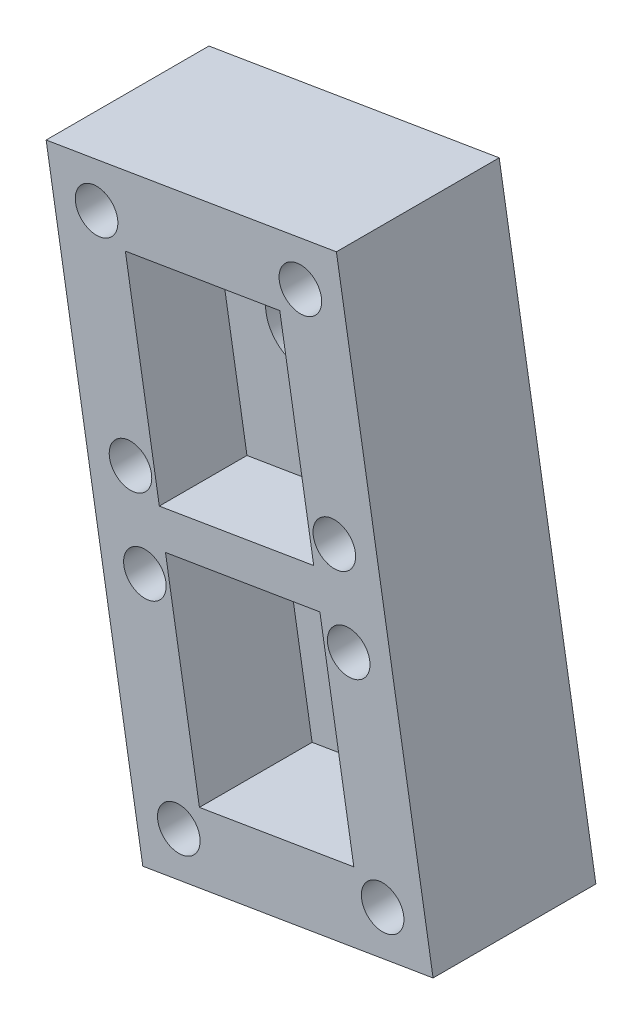
ISO-10303-21;
HEADER;
FILE_DESCRIPTION(('STEP AP214'),'2;1');
FILE_NAME('part.step','',(''),(''),'','','');
FILE_SCHEMA(('AUTOMOTIVE_DESIGN { 1 0 10303 214 1 1 1 1 }'));
ENDSEC;
DATA;
#1=APPLICATION_CONTEXT('core data for automotive mechanical design processes');
#2=APPLICATION_PROTOCOL_DEFINITION('international standard','automotive_design',2000,#1);
#3=PRODUCT_CONTEXT('',#1,'mechanical');
#4=PRODUCT('Part','Part','',(#3));
#5=PRODUCT_RELATED_PRODUCT_CATEGORY('part','',(#4));
#6=PRODUCT_DEFINITION_FORMATION('','',#4);
#7=PRODUCT_DEFINITION_CONTEXT('part definition',#1,'design');
#8=PRODUCT_DEFINITION('design','',#6,#7);
#9=PRODUCT_DEFINITION_SHAPE('','',#8);
#10=(LENGTH_UNIT() NAMED_UNIT(*) SI_UNIT(.MILLI.,.METRE.));
#11=(NAMED_UNIT(*) PLANE_ANGLE_UNIT() SI_UNIT($,.RADIAN.));
#12=(NAMED_UNIT(*) SI_UNIT($,.STERADIAN.) SOLID_ANGLE_UNIT());
#13=UNCERTAINTY_MEASURE_WITH_UNIT(LENGTH_MEASURE(1.E-05),#10,'distance_accuracy_value','');
#14=(GEOMETRIC_REPRESENTATION_CONTEXT(3) GLOBAL_UNCERTAINTY_ASSIGNED_CONTEXT((#13)) GLOBAL_UNIT_ASSIGNED_CONTEXT((#10,
#11,#12)) REPRESENTATION_CONTEXT('',''));
#15=CARTESIAN_POINT('',(0.,0.,0.));
#16=DIRECTION('',(0.,0.,1.));
#17=DIRECTION('',(1.,0.,0.));
#18=AXIS2_PLACEMENT_3D('',#15,#16,#17);
#19=CARTESIAN_POINT('',(202.203704217612,0.185034912218684,-50.762168081862));
#20=DIRECTION('',(0.,0.,-1.));
#21=DIRECTION('',(-1.,0.,0.));
#22=AXIS2_PLACEMENT_3D('',#19,#20,#21);
#23=CYLINDRICAL_SURFACE('',#22,3.49999999999999);
#24=CARTESIAN_POINT('',(202.203704217612,0.185034912218684,-56.762168081862));
#25=DIRECTION('',(0.,0.,-1.));
#26=DIRECTION('',(-1.,0.,0.));
#27=AXIS2_PLACEMENT_3D('',#24,#25,#26);
#28=CIRCLE('',#27,3.49999999999999);
#29=CARTESIAN_POINT('',(198.703704217612,0.185034912218684,-56.762168081862));
#30=VERTEX_POINT('',#29);
#31=EDGE_CURVE('E155',#30,#30,#28,.T.);
#32=ORIENTED_EDGE('',*,*,#31,.T.);
#33=EDGE_LOOP('',(#32));
#34=FACE_BOUND('',#33,.T.);
#35=CARTESIAN_POINT('',(202.203704217612,0.185034912218684,-52.762168081862));
#36=DIRECTION('',(0.,0.,1.));
#37=DIRECTION('',(1.,0.,0.));
#38=AXIS2_PLACEMENT_3D('',#35,#36,#37);
#39=CIRCLE('',#38,3.49999999999999);
#40=CARTESIAN_POINT('',(205.703704217612,0.185034912218684,-52.762168081862));
#41=VERTEX_POINT('',#40);
#42=EDGE_CURVE('E39',#41,#41,#39,.F.);
#43=ORIENTED_EDGE('',*,*,#42,.F.);
#44=EDGE_LOOP('',(#43));
#45=FACE_BOUND('',#44,.T.);
#46=ADVANCED_FACE('F35',(#34,#45),#23,.F.);
#47=CARTESIAN_POINT('',(0.,0.,-56.762168081862));
#48=DIRECTION('',(0.,0.,-1.));
#49=DIRECTION('',(-1.,0.,0.));
#50=AXIS2_PLACEMENT_3D('',#47,#48,#49);
#51=PLANE('',#50);
#52=CARTESIAN_POINT('',(202.203704217612,0.185034912218662,-56.762168081862));
#53=DIRECTION('',(0.,0.,-1.));
#54=DIRECTION('',(-1.,0.,0.));
#55=AXIS2_PLACEMENT_3D('',#52,#53,#54);
#56=CIRCLE('',#55,6.00000000000002);
#57=CARTESIAN_POINT('',(196.203704217612,0.185034912218662,-56.762168081862));
#58=VERTEX_POINT('',#57);
#59=EDGE_CURVE('E212',#58,#58,#56,.T.);
#60=ORIENTED_EDGE('',*,*,#59,.T.);
#61=EDGE_LOOP('',(#60));
#62=FACE_BOUND('',#61,.T.);
#63=ORIENTED_EDGE('',*,*,#31,.F.);
#64=EDGE_LOOP('',(#63));
#65=FACE_BOUND('',#64,.T.);
#66=ADVANCED_FACE('F350',(#62,#65),#51,.T.);
#67=CARTESIAN_POINT('',(191.152975596137,28.5047523708112,-42.762168081862));
#68=DIRECTION('',(-0.986423533912994,-0.164221228051065,0.));
#69=DIRECTION('',(0.164221228051065,-0.986423533912994,0.));
#70=AXIS2_PLACEMENT_3D('',#67,#68,#69);
#71=PLANE('',#70);
#72=DIRECTION('',(0.,0.,-1.));
#73=VECTOR('',#72,1.);
#74=CARTESIAN_POINT('',(194.355289543133,9.26949345950775,-42.762168081862));
#75=LINE('',#74,#73);
#76=CARTESIAN_POINT('',(194.355289543133,9.26949345950775,-43.762168081862));
#77=VERTEX_POINT('',#76);
#78=CARTESIAN_POINT('',(194.355289543133,9.26949345950775,-52.762168081862));
#79=VERTEX_POINT('',#78);
#80=EDGE_CURVE('E135',#77,#79,#75,.T.);
#81=ORIENTED_EDGE('',*,*,#80,.F.);
#82=DIRECTION('',(0.164221228051065,-0.986423533912994,0.));
#83=VECTOR('',#82,1.);
#84=CARTESIAN_POINT('',(191.152975596137,28.5047523708112,-43.762168081862));
#85=LINE('',#84,#83);
#86=CARTESIAN_POINT('',(197.064939805975,-7.00649485005672,-43.762168081862));
#87=VERTEX_POINT('',#86);
#88=EDGE_CURVE('E59',#77,#87,#85,.T.);
#89=ORIENTED_EDGE('',*,*,#88,.T.);
#90=DIRECTION('',(0.,0.,-1.));
#91=VECTOR('',#90,1.);
#92=CARTESIAN_POINT('',(197.064939805975,-7.00649485005673,-42.762168081862));
#93=LINE('',#92,#91);
#94=CARTESIAN_POINT('',(197.064939805975,-7.00649485005673,-52.762168081862));
#95=VERTEX_POINT('',#94);
#96=EDGE_CURVE('E258',#87,#95,#93,.T.);
#97=ORIENTED_EDGE('',*,*,#96,.T.);
#98=DIRECTION('',(0.164221228051065,-0.986423533912994,0.));
#99=VECTOR('',#98,1.);
#100=CARTESIAN_POINT('',(194.355289543133,9.26949345950775,-52.762168081862));
#101=LINE('',#100,#99);
#102=EDGE_CURVE('E145',#79,#95,#101,.T.);
#103=ORIENTED_EDGE('',*,*,#102,.F.);
#104=EDGE_LOOP('',(#81,#89,#97,#103));
#105=FACE_BOUND('',#104,.T.);
#106=ADVANCED_FACE('F356',(#105),#71,.F.);
#107=DIRECTION('',(0.,0.,-1.));
#108=VECTOR('',#107,1.);
#109=CARTESIAN_POINT('',(191.152975596137,28.5047523708112,-42.762168081862));
#110=LINE('',#109,#108);
#111=CARTESIAN_POINT('',(191.152975596137,28.5047523708112,-43.762168081862));
#112=VERTEX_POINT('',#111);
#113=CARTESIAN_POINT('',(191.152975596137,28.5047523708112,-50.762168081862));
#114=VERTEX_POINT('',#113);
#115=EDGE_CURVE('E257',#112,#114,#110,.T.);
#116=ORIENTED_EDGE('',*,*,#115,.F.);
#117=DIRECTION('',(0.164221228051065,-0.986423533912994,0.));
#118=VECTOR('',#117,1.);
#119=CARTESIAN_POINT('',(191.152975596137,28.5047523708112,-43.762168081862));
#120=LINE('',#119,#118);
#121=CARTESIAN_POINT('',(193.86262585898,12.2287640612467,-43.762168081862));
#122=VERTEX_POINT('',#121);
#123=EDGE_CURVE('E173',#112,#122,#120,.T.);
#124=ORIENTED_EDGE('',*,*,#123,.T.);
#125=DIRECTION('',(0.,0.,-1.));
#126=VECTOR('',#125,1.);
#127=CARTESIAN_POINT('',(193.86262585898,12.2287640612467,-42.762168081862));
#128=LINE('',#127,#126);
#129=CARTESIAN_POINT('',(193.86262585898,12.2287640612467,-50.762168081862));
#130=VERTEX_POINT('',#129);
#131=EDGE_CURVE('E221',#122,#130,#128,.T.);
#132=ORIENTED_EDGE('',*,*,#131,.T.);
#133=DIRECTION('',(-0.164221228051065,0.986423533912994,0.));
#134=VECTOR('',#133,1.);
#135=CARTESIAN_POINT('',(191.152975596137,28.5047523708112,-50.762168081862));
#136=LINE('',#135,#134);
#137=EDGE_CURVE('E244',#130,#114,#136,.T.);
#138=ORIENTED_EDGE('',*,*,#137,.T.);
#139=EDGE_LOOP('',(#116,#124,#132,#138));
#140=FACE_BOUND('',#139,.T.);
#141=ADVANCED_FACE('F308',(#140),#71,.F.);
#142=CARTESIAN_POINT('',(203.48326977005,30.5575177214495,-42.762168081862));
#143=DIRECTION('',(0.986423533912995,0.164221228051064,0.));
#144=DIRECTION('',(-0.164221228051064,0.986423533912995,0.));
#145=AXIS2_PLACEMENT_3D('',#142,#143,#144);
#146=PLANE('',#145);
#147=DIRECTION('',(0.,0.,-1.));
#148=VECTOR('',#147,1.);
#149=CARTESIAN_POINT('',(209.395233979888,-4.95372949941843,-42.762168081862));
#150=LINE('',#149,#148);
#151=CARTESIAN_POINT('',(209.395233979888,-4.95372949941843,-43.762168081862));
#152=VERTEX_POINT('',#151);
#153=CARTESIAN_POINT('',(209.395233979888,-4.95372949941843,-52.762168081862));
#154=VERTEX_POINT('',#153);
#155=EDGE_CURVE('E261',#152,#154,#150,.T.);
#156=ORIENTED_EDGE('',*,*,#155,.F.);
#157=DIRECTION('',(-0.164221228051064,0.986423533912995,0.));
#158=VECTOR('',#157,1.);
#159=CARTESIAN_POINT('',(203.48326977005,30.5575177214495,-43.762168081862));
#160=LINE('',#159,#158);
#161=CARTESIAN_POINT('',(206.685583717045,11.322258810146,-43.762168081862));
#162=VERTEX_POINT('',#161);
#163=EDGE_CURVE('E133',#152,#162,#160,.T.);
#164=ORIENTED_EDGE('',*,*,#163,.T.);
#165=DIRECTION('',(0.,0.,-1.));
#166=VECTOR('',#165,1.);
#167=CARTESIAN_POINT('',(206.685583717045,11.322258810146,-42.762168081862));
#168=LINE('',#167,#166);
#169=CARTESIAN_POINT('',(206.685583717045,11.322258810146,-52.762168081862));
#170=VERTEX_POINT('',#169);
#171=EDGE_CURVE('E126',#162,#170,#168,.T.);
#172=ORIENTED_EDGE('',*,*,#171,.T.);
#173=DIRECTION('',(-0.164221228051064,0.986423533912995,0.));
#174=VECTOR('',#173,1.);
#175=CARTESIAN_POINT('',(209.395233979888,-4.95372949941843,-52.762168081862));
#176=LINE('',#175,#174);
#177=EDGE_CURVE('E131',#154,#170,#176,.T.);
#178=ORIENTED_EDGE('',*,*,#177,.F.);
#179=EDGE_LOOP('',(#156,#164,#172,#178));
#180=FACE_BOUND('',#179,.T.);
#181=ADVANCED_FACE('F129',(#180),#146,.F.);
#182=DIRECTION('',(0.,0.,-1.));
#183=VECTOR('',#182,1.);
#184=CARTESIAN_POINT('',(206.192920032892,14.281529411885,-42.762168081862));
#185=LINE('',#184,#183);
#186=CARTESIAN_POINT('',(206.192920032892,14.281529411885,-43.762168081862));
#187=VERTEX_POINT('',#186);
#188=CARTESIAN_POINT('',(206.192920032892,14.281529411885,-50.762168081862));
#189=VERTEX_POINT('',#188);
#190=EDGE_CURVE('E136',#187,#189,#185,.T.);
#191=ORIENTED_EDGE('',*,*,#190,.F.);
#192=DIRECTION('',(-0.164221228051064,0.986423533912995,0.));
#193=VECTOR('',#192,1.);
#194=CARTESIAN_POINT('',(203.48326977005,30.5575177214495,-43.762168081862));
#195=LINE('',#194,#193);
#196=CARTESIAN_POINT('',(203.48326977005,30.5575177214495,-43.762168081862));
#197=VERTEX_POINT('',#196);
#198=EDGE_CURVE('E169',#187,#197,#195,.T.);
#199=ORIENTED_EDGE('',*,*,#198,.T.);
#200=DIRECTION('',(0.,0.,-1.));
#201=VECTOR('',#200,1.);
#202=CARTESIAN_POINT('',(203.48326977005,30.5575177214495,-42.762168081862));
#203=LINE('',#202,#201);
#204=CARTESIAN_POINT('',(203.48326977005,30.5575177214495,-50.762168081862));
#205=VERTEX_POINT('',#204);
#206=EDGE_CURVE('E263',#197,#205,#203,.T.);
#207=ORIENTED_EDGE('',*,*,#206,.T.);
#208=DIRECTION('',(0.164221228051064,-0.986423533912994,0.));
#209=VECTOR('',#208,1.);
#210=CARTESIAN_POINT('',(203.48326977005,30.5575177214495,-50.762168081862));
#211=LINE('',#210,#209);
#212=EDGE_CURVE('E254',#205,#189,#211,.T.);
#213=ORIENTED_EDGE('',*,*,#212,.T.);
#214=EDGE_LOOP('',(#191,#199,#207,#213));
#215=FACE_BOUND('',#214,.T.);
#216=ADVANCED_FACE('F297',(#215),#146,.F.);
#217=CARTESIAN_POINT('',(0.,0.,-50.762168081862));
#218=DIRECTION('',(0.,0.,-1.));
#219=DIRECTION('',(-1.,0.,0.));
#220=AXIS2_PLACEMENT_3D('',#217,#218,#219);
#221=PLANE('',#220);
#222=CARTESIAN_POINT('',(198.344505358412,23.3659879591741,-50.762168081862));
#223=DIRECTION('',(0.,0.,-1.));
#224=DIRECTION('',(-1.,0.,0.));
#225=AXIS2_PLACEMENT_3D('',#222,#223,#224);
#226=CIRCLE('',#225,2.99999999999999);
#227=CARTESIAN_POINT('',(195.344505358412,23.3659879591741,-50.762168081862));
#228=VERTEX_POINT('',#227);
#229=EDGE_CURVE('E225',#228,#228,#226,.T.);
#230=ORIENTED_EDGE('',*,*,#229,.T.);
#231=EDGE_LOOP('',(#230));
#232=FACE_BOUND('',#231,.T.);
#233=DIRECTION('',(-0.986423533912994,-0.164221228051065,0.));
#234=VECTOR('',#233,1.);
#235=CARTESIAN_POINT('',(193.86262585898,12.2287640612467,-50.762168081862));
#236=LINE('',#235,#234);
#237=EDGE_CURVE('E218',#189,#130,#236,.T.);
#238=ORIENTED_EDGE('',*,*,#237,.F.);
#239=ORIENTED_EDGE('',*,*,#212,.F.);
#240=DIRECTION('',(0.986423533912994,0.164221228051065,0.));
#241=VECTOR('',#240,1.);
#242=CARTESIAN_POINT('',(191.152975596137,28.5047523708112,-50.762168081862));
#243=LINE('',#242,#241);
#244=EDGE_CURVE('E251',#114,#205,#243,.T.);
#245=ORIENTED_EDGE('',*,*,#244,.F.);
#246=ORIENTED_EDGE('',*,*,#137,.F.);
#247=EDGE_LOOP('',(#238,#239,#245,#246));
#248=FACE_BOUND('',#247,.T.);
#249=ADVANCED_FACE('F302',(#232,#248),#221,.F.);
#250=CARTESIAN_POINT('',(198.344505358412,23.3659879591741,-56.762168081862));
#251=DIRECTION('',(0.,0.,1.));
#252=DIRECTION('',(1.,0.,0.));
#253=AXIS2_PLACEMENT_3D('',#250,#251,#252);
#254=CYLINDRICAL_SURFACE('',#253,2.99999999999999);
#255=ORIENTED_EDGE('',*,*,#229,.F.);
#256=EDGE_LOOP('',(#255));
#257=FACE_BOUND('',#256,.T.);
#258=CARTESIAN_POINT('',(198.344505358412,23.3659879591741,-56.762168081862));
#259=DIRECTION('',(0.,0.,-1.));
#260=DIRECTION('',(-1.,0.,0.));
#261=AXIS2_PLACEMENT_3D('',#258,#259,#260);
#262=CIRCLE('',#261,2.99999999999999);
#263=CARTESIAN_POINT('',(195.344505358412,23.3659879591741,-56.762168081862));
#264=VERTEX_POINT('',#263);
#265=EDGE_CURVE('E161',#264,#264,#262,.T.);
#266=ORIENTED_EDGE('',*,*,#265,.T.);
#267=EDGE_LOOP('',(#266));
#268=FACE_BOUND('',#267,.T.);
#269=ADVANCED_FACE('F374',(#257,#268),#254,.F.);
#270=CARTESIAN_POINT('',(215.72378017069,-9.47584218165903,-42.762168081862));
#271=DIRECTION('',(0.164221228051065,-0.986423533912994,0.));
#272=DIRECTION('',(0.986423533912994,0.164221228051065,0.));
#273=AXIS2_PLACEMENT_3D('',#270,#271,#272);
#274=PLANE('',#273);
#275=DIRECTION('',(-0.986423533912995,-0.164221228051062,0.));
#276=VECTOR('',#275,1.);
#277=CARTESIAN_POINT('',(217.20341547156,-9.22951033958249,-43.762168081862));
#278=LINE('',#277,#276);
#279=CARTESIAN_POINT('',(215.72378017069,-9.47584218165909,-43.762168081862));
#280=VERTEX_POINT('',#279);
#281=CARTESIAN_POINT('',(192.542827123735,-13.335041040859,-43.762168081862));
#282=VERTEX_POINT('',#281);
#283=EDGE_CURVE('E166',#280,#282,#278,.T.);
#284=ORIENTED_EDGE('',*,*,#283,.T.);
#285=DIRECTION('',(0.,0.,-1.));
#286=VECTOR('',#285,1.);
#287=CARTESIAN_POINT('',(192.542827123735,-13.335041040859,-42.762168081862));
#288=LINE('',#287,#286);
#289=CARTESIAN_POINT('',(192.542827123735,-13.335041040859,-56.762168081862));
#290=VERTEX_POINT('',#289);
#291=EDGE_CURVE('E260',#282,#290,#288,.T.);
#292=ORIENTED_EDGE('',*,*,#291,.T.);
#293=DIRECTION('',(-0.986423533912994,-0.164221228051065,0.));
#294=VECTOR('',#293,1.);
#295=CARTESIAN_POINT('',(215.72378017069,-9.47584218165903,-56.762168081862));
#296=LINE('',#295,#294);
#297=CARTESIAN_POINT('',(215.72378017069,-9.47584218165903,-56.762168081862));
#298=VERTEX_POINT('',#297);
#299=EDGE_CURVE('E231',#298,#290,#296,.T.);
#300=ORIENTED_EDGE('',*,*,#299,.F.);
#301=DIRECTION('',(0.,0.,-1.));
#302=VECTOR('',#301,1.);
#303=CARTESIAN_POINT('',(215.72378017069,-9.47584218165903,-42.762168081862));
#304=LINE('',#303,#302);
#305=EDGE_CURVE('E282',#280,#298,#304,.T.);
#306=ORIENTED_EDGE('',*,*,#305,.F.);
#307=EDGE_LOOP('',(#284,#292,#300,#306));
#308=FACE_BOUND('',#307,.T.);
#309=ADVANCED_FACE('F37',(#308),#274,.T.);
#310=CARTESIAN_POINT('',(208.00538245229,36.8860639122518,-42.762168081862));
#311=DIRECTION('',(0.986423533912995,0.164221228051063,0.));
#312=DIRECTION('',(-0.164221228051063,0.986423533912995,0.));
#313=AXIS2_PLACEMENT_3D('',#310,#311,#312);
#314=PLANE('',#313);
#315=DIRECTION('',(-0.164221228051063,0.986423533912995,0.));
#316=VECTOR('',#315,1.);
#317=CARTESIAN_POINT('',(208.00538245229,36.8860639122518,-43.762168081862));
#318=LINE('',#317,#316);
#319=CARTESIAN_POINT('',(208.00538245229,36.8860639122518,-43.762168081862));
#320=VERTEX_POINT('',#319);
#321=EDGE_CURVE('E210',#280,#320,#318,.T.);
#322=ORIENTED_EDGE('',*,*,#321,.F.);
#323=ORIENTED_EDGE('',*,*,#305,.T.);
#324=DIRECTION('',(0.164221228051063,-0.986423533912995,0.));
#325=VECTOR('',#324,1.);
#326=CARTESIAN_POINT('',(208.00538245229,36.8860639122518,-56.762168081862));
#327=LINE('',#326,#325);
#328=CARTESIAN_POINT('',(208.00538245229,36.8860639122518,-56.762168081862));
#329=VERTEX_POINT('',#328);
#330=EDGE_CURVE('E228',#329,#298,#327,.T.);
#331=ORIENTED_EDGE('',*,*,#330,.F.);
#332=DIRECTION('',(0.,0.,-1.));
#333=VECTOR('',#332,1.);
#334=CARTESIAN_POINT('',(208.00538245229,36.8860639122518,-42.762168081862));
#335=LINE('',#334,#333);
#336=EDGE_CURVE('E284',#320,#329,#335,.T.);
#337=ORIENTED_EDGE('',*,*,#336,.F.);
#338=EDGE_LOOP('',(#322,#323,#331,#337));
#339=FACE_BOUND('',#338,.T.);
#340=ADVANCED_FACE('F396',(#339),#314,.T.);
#341=CARTESIAN_POINT('',(184.824429405335,33.0268650530518,-42.762168081862));
#342=DIRECTION('',(-0.164221228051063,0.986423533912995,0.));
#343=DIRECTION('',(-0.986423533912995,-0.164221228051063,0.));
#344=AXIS2_PLACEMENT_3D('',#341,#342,#343);
#345=PLANE('',#344);
#346=DIRECTION('',(-0.986423533912995,-0.164221228051062,0.));
#347=VECTOR('',#346,1.);
#348=CARTESIAN_POINT('',(209.48501775316,37.1323957543284,-43.762168081862));
#349=LINE('',#348,#347);
#350=CARTESIAN_POINT('',(184.824429405335,33.0268650530518,-43.762168081862));
#351=VERTEX_POINT('',#350);
#352=EDGE_CURVE('E51',#320,#351,#349,.T.);
#353=ORIENTED_EDGE('',*,*,#352,.F.);
#354=ORIENTED_EDGE('',*,*,#336,.T.);
#355=DIRECTION('',(0.986423533912995,0.164221228051063,0.));
#356=VECTOR('',#355,1.);
#357=CARTESIAN_POINT('',(184.824429405335,33.0268650530518,-56.762168081862));
#358=LINE('',#357,#356);
#359=CARTESIAN_POINT('',(184.824429405335,33.0268650530518,-56.762168081862));
#360=VERTEX_POINT('',#359);
#361=EDGE_CURVE('E237',#360,#329,#358,.T.);
#362=ORIENTED_EDGE('',*,*,#361,.F.);
#363=DIRECTION('',(0.,0.,-1.));
#364=VECTOR('',#363,1.);
#365=CARTESIAN_POINT('',(184.824429405335,33.0268650530518,-42.762168081862));
#366=LINE('',#365,#364);
#367=EDGE_CURVE('E286',#351,#360,#366,.T.);
#368=ORIENTED_EDGE('',*,*,#367,.F.);
#369=EDGE_LOOP('',(#353,#354,#362,#368));
#370=FACE_BOUND('',#369,.T.);
#371=ADVANCED_FACE('F404',(#370),#345,.T.);
#372=CARTESIAN_POINT('',(192.542827123735,-13.335041040859,-42.762168081862));
#373=DIRECTION('',(-0.986423533912995,-0.164221228051062,0.));
#374=DIRECTION('',(0.164221228051062,-0.986423533912995,0.));
#375=AXIS2_PLACEMENT_3D('',#372,#373,#374);
#376=PLANE('',#375);
#377=DIRECTION('',(0.164221228051062,-0.986423533912995,0.));
#378=VECTOR('',#377,1.);
#379=CARTESIAN_POINT('',(184.824429405335,33.0268650530518,-43.762168081862));
#380=LINE('',#379,#378);
#381=EDGE_CURVE('E164',#351,#282,#380,.T.);
#382=ORIENTED_EDGE('',*,*,#381,.F.);
#383=ORIENTED_EDGE('',*,*,#367,.T.);
#384=DIRECTION('',(-0.164221228051062,0.986423533912995,0.));
#385=VECTOR('',#384,1.);
#386=CARTESIAN_POINT('',(192.542827123735,-13.335041040859,-56.762168081862));
#387=LINE('',#386,#385);
#388=EDGE_CURVE('E234',#290,#360,#387,.T.);
#389=ORIENTED_EDGE('',*,*,#388,.F.);
#390=ORIENTED_EDGE('',*,*,#291,.F.);
#391=EDGE_LOOP('',(#382,#383,#389,#390));
#392=FACE_BOUND('',#391,.T.);
#393=ADVANCED_FACE('F401',(#392),#376,.T.);
#394=CARTESIAN_POINT('',(197.064939805975,-7.00649485005673,-42.762168081862));
#395=DIRECTION('',(0.164221228051064,-0.986423533912995,0.));
#396=DIRECTION('',(0.986423533912995,0.164221228051064,0.));
#397=AXIS2_PLACEMENT_3D('',#394,#395,#396);
#398=PLANE('',#397);
#399=ORIENTED_EDGE('',*,*,#96,.F.);
#400=DIRECTION('',(0.986423533912995,0.164221228051064,0.));
#401=VECTOR('',#400,1.);
#402=CARTESIAN_POINT('',(197.064939805975,-7.00649485005673,-43.762168081862));
#403=LINE('',#402,#401);
#404=EDGE_CURVE('E183',#87,#152,#403,.T.);
#405=ORIENTED_EDGE('',*,*,#404,.T.);
#406=ORIENTED_EDGE('',*,*,#155,.T.);
#407=DIRECTION('',(0.986423533912995,0.164221228051064,0.));
#408=VECTOR('',#407,1.);
#409=CARTESIAN_POINT('',(197.064939805975,-7.00649485005673,-52.762168081862));
#410=LINE('',#409,#408);
#411=EDGE_CURVE('E150',#95,#154,#410,.T.);
#412=ORIENTED_EDGE('',*,*,#411,.F.);
#413=EDGE_LOOP('',(#399,#405,#406,#412));
#414=FACE_BOUND('',#413,.T.);
#415=ADVANCED_FACE('F382',(#414),#398,.F.);
#416=CARTESIAN_POINT('',(191.152975596137,28.5047523708112,-42.762168081862));
#417=DIRECTION('',(-0.164221228051065,0.986423533912994,0.));
#418=DIRECTION('',(-0.986423533912994,-0.164221228051065,0.));
#419=AXIS2_PLACEMENT_3D('',#416,#417,#418);
#420=PLANE('',#419);
#421=ORIENTED_EDGE('',*,*,#206,.F.);
#422=DIRECTION('',(-0.986423533912994,-0.164221228051065,0.));
#423=VECTOR('',#422,1.);
#424=CARTESIAN_POINT('',(191.152975596137,28.5047523708112,-43.762168081862));
#425=LINE('',#424,#423);
#426=EDGE_CURVE('E176',#197,#112,#425,.T.);
#427=ORIENTED_EDGE('',*,*,#426,.T.);
#428=ORIENTED_EDGE('',*,*,#115,.T.);
#429=ORIENTED_EDGE('',*,*,#244,.T.);
#430=EDGE_LOOP('',(#421,#427,#428,#429));
#431=FACE_BOUND('',#430,.T.);
#432=ADVANCED_FACE('F305',(#431),#420,.F.);
#433=CARTESIAN_POINT('',(202.203704217612,0.185034912218662,-56.762168081862));
#434=DIRECTION('',(0.,0.,-1.));
#435=DIRECTION('',(-1.,0.,0.));
#436=AXIS2_PLACEMENT_3D('',#433,#434,#435);
#437=CIRCLE('',#436,10.);
#438=CARTESIAN_POINT('',(192.203704217612,0.185034912218662,-56.762168081862));
#439=VERTEX_POINT('',#438);
#440=EDGE_CURVE('E215',#439,#439,#437,.T.);
#441=ORIENTED_EDGE('',*,*,#440,.F.);
#442=EDGE_LOOP('',(#441));
#443=FACE_BOUND('',#442,.T.);
#444=ORIENTED_EDGE('',*,*,#330,.T.);
#445=ORIENTED_EDGE('',*,*,#299,.T.);
#446=ORIENTED_EDGE('',*,*,#388,.T.);
#447=ORIENTED_EDGE('',*,*,#361,.T.);
#448=EDGE_LOOP('',(#444,#445,#446,#447));
#449=FACE_BOUND('',#448,.T.);
#450=ORIENTED_EDGE('',*,*,#265,.F.);
#451=EDGE_LOOP('',(#450));
#452=FACE_BOUND('',#451,.T.);
#453=ADVANCED_FACE('F358',(#443,#449,#452),#51,.T.);
#454=CARTESIAN_POINT('',(194.355289543133,9.26949345950775,-42.762168081862));
#455=DIRECTION('',(-0.164221228051063,0.986423533912995,0.));
#456=DIRECTION('',(-0.986423533912995,-0.164221228051063,0.));
#457=AXIS2_PLACEMENT_3D('',#454,#455,#456);
#458=PLANE('',#457);
#459=ORIENTED_EDGE('',*,*,#171,.F.);
#460=DIRECTION('',(-0.986423533912995,-0.164221228051063,0.));
#461=VECTOR('',#460,1.);
#462=CARTESIAN_POINT('',(194.355289543133,9.26949345950775,-43.762168081862));
#463=LINE('',#462,#461);
#464=EDGE_CURVE('E179',#162,#77,#463,.T.);
#465=ORIENTED_EDGE('',*,*,#464,.T.);
#466=ORIENTED_EDGE('',*,*,#80,.T.);
#467=DIRECTION('',(-0.986423533912994,-0.164221228051063,0.));
#468=VECTOR('',#467,1.);
#469=CARTESIAN_POINT('',(206.685583717045,11.322258810146,-52.762168081862));
#470=LINE('',#469,#468);
#471=EDGE_CURVE('E139',#170,#79,#470,.T.);
#472=ORIENTED_EDGE('',*,*,#471,.F.);
#473=EDGE_LOOP('',(#459,#465,#466,#472));
#474=FACE_BOUND('',#473,.T.);
#475=ADVANCED_FACE('F140',(#474),#458,.F.);
#476=CARTESIAN_POINT('',(193.86262585898,12.2287640612467,-42.762168081862));
#477=DIRECTION('',(0.164221228051065,-0.986423533912994,0.));
#478=DIRECTION('',(0.986423533912994,0.164221228051065,0.));
#479=AXIS2_PLACEMENT_3D('',#476,#477,#478);
#480=PLANE('',#479);
#481=ORIENTED_EDGE('',*,*,#131,.F.);
#482=DIRECTION('',(0.986423533912994,0.164221228051065,0.));
#483=VECTOR('',#482,1.);
#484=CARTESIAN_POINT('',(193.86262585898,12.2287640612467,-43.762168081862));
#485=LINE('',#484,#483);
#486=EDGE_CURVE('E44',#122,#187,#485,.T.);
#487=ORIENTED_EDGE('',*,*,#486,.T.);
#488=ORIENTED_EDGE('',*,*,#190,.T.);
#489=ORIENTED_EDGE('',*,*,#237,.T.);
#490=EDGE_LOOP('',(#481,#487,#488,#489));
#491=FACE_BOUND('',#490,.T.);
#492=ADVANCED_FACE('F293',(#491),#480,.F.);
#493=CARTESIAN_POINT('',(202.203704217612,0.185034912218662,-52.762168081862));
#494=DIRECTION('',(0.,0.,-1.));
#495=DIRECTION('',(-1.,0.,0.));
#496=AXIS2_PLACEMENT_3D('',#493,#494,#495);
#497=CYLINDRICAL_SURFACE('',#496,10.);
#498=CARTESIAN_POINT('',(202.203704217612,0.185034912218662,-54.262168081862));
#499=DIRECTION('',(0.,0.,-1.));
#500=DIRECTION('',(-1.,0.,0.));
#501=AXIS2_PLACEMENT_3D('',#498,#499,#500);
#502=CIRCLE('',#501,10.);
#503=CARTESIAN_POINT('',(192.203704217612,0.185034912218662,-54.262168081862));
#504=VERTEX_POINT('',#503);
#505=EDGE_CURVE('E158',#504,#504,#502,.T.);
#506=ORIENTED_EDGE('',*,*,#505,.F.);
#507=EDGE_LOOP('',(#506));
#508=FACE_BOUND('',#507,.T.);
#509=ORIENTED_EDGE('',*,*,#440,.T.);
#510=EDGE_LOOP('',(#509));
#511=FACE_BOUND('',#510,.T.);
#512=ADVANCED_FACE('F365',(#508,#511),#497,.F.);
#513=CARTESIAN_POINT('',(202.203704217612,0.185034912218662,-52.762168081862));
#514=DIRECTION('',(0.,0.,-1.));
#515=DIRECTION('',(-1.,0.,0.));
#516=AXIS2_PLACEMENT_3D('',#513,#514,#515);
#517=CYLINDRICAL_SURFACE('',#516,6.00000000000002);
#518=CARTESIAN_POINT('',(202.203704217612,0.185034912218662,-54.262168081862));
#519=DIRECTION('',(0.,0.,-1.));
#520=DIRECTION('',(-1.,0.,0.));
#521=AXIS2_PLACEMENT_3D('',#518,#519,#520);
#522=CIRCLE('',#521,6.00000000000002);
#523=CARTESIAN_POINT('',(196.203704217612,0.185034912218662,-54.262168081862));
#524=VERTEX_POINT('',#523);
#525=EDGE_CURVE('E11',#524,#524,#522,.F.);
#526=ORIENTED_EDGE('',*,*,#525,.F.);
#527=EDGE_LOOP('',(#526));
#528=FACE_BOUND('',#527,.T.);
#529=ORIENTED_EDGE('',*,*,#59,.F.);
#530=EDGE_LOOP('',(#529));
#531=FACE_BOUND('',#530,.T.);
#532=ADVANCED_FACE('F312',(#528,#531),#517,.T.);
#533=CARTESIAN_POINT('',(209.48501775316,37.1323957543284,-43.762168081862));
#534=DIRECTION('',(0.,0.,-1.));
#535=DIRECTION('',(0.,1.,0.));
#536=AXIS2_PLACEMENT_3D('',#533,#534,#535);
#537=PLANE('',#536);
#538=ORIENTED_EDGE('',*,*,#321,.T.);
#539=ORIENTED_EDGE('',*,*,#352,.T.);
#540=ORIENTED_EDGE('',*,*,#381,.T.);
#541=ORIENTED_EDGE('',*,*,#283,.F.);
#542=EDGE_LOOP('',(#538,#539,#540,#541));
#543=FACE_BOUND('',#542,.T.);
#544=CARTESIAN_POINT('',(188.851686072209,30.149156982535,-43.762168081862));
#545=DIRECTION('',(0.,0.,-1.));
#546=DIRECTION('',(0.,1.,0.));
#547=AXIS2_PLACEMENT_3D('',#544,#545,#546);
#548=CIRCLE('',#547,1.70000000000002);
#549=CARTESIAN_POINT('',(188.851686072209,31.8491569825351,-43.762168081862));
#550=VERTEX_POINT('',#549);
#551=EDGE_CURVE('E204',#550,#550,#548,.F.);
#552=ORIENTED_EDGE('',*,*,#551,.F.);
#553=EDGE_LOOP('',(#552));
#554=FACE_BOUND('',#553,.T.);
#555=CARTESIAN_POINT('',(207.837324644616,16.5828189358132,-43.762168081862));
#556=DIRECTION('',(0.,0.,-1.));
#557=DIRECTION('',(0.,1.,0.));
#558=AXIS2_PLACEMENT_3D('',#555,#556,#557);
#559=CIRCLE('',#558,1.70000000000004);
#560=CARTESIAN_POINT('',(207.837324644616,18.2828189358132,-43.762168081862));
#561=VERTEX_POINT('',#560);
#562=EDGE_CURVE('E198',#561,#561,#559,.F.);
#563=ORIENTED_EDGE('',*,*,#562,.F.);
#564=EDGE_LOOP('',(#563));
#565=FACE_BOUND('',#564,.T.);
#566=CARTESIAN_POINT('',(208.986873240973,9.67785419842207,-43.762168081862));
#567=DIRECTION('',(0.,0.,-1.));
#568=DIRECTION('',(0.,1.,0.));
#569=AXIS2_PLACEMENT_3D('',#566,#567,#568);
#570=CIRCLE('',#569,1.70000000000002);
#571=CARTESIAN_POINT('',(208.986873240973,11.3778541984221,-43.762168081862));
#572=VERTEX_POINT('',#571);
#573=EDGE_CURVE('E192',#572,#572,#570,.F.);
#574=ORIENTED_EDGE('',*,*,#573,.F.);
#575=EDGE_LOOP('',(#574));
#576=FACE_BOUND('',#575,.T.);
#577=CARTESIAN_POINT('',(195.420535194251,-9.30778437398485,-43.762168081862));
#578=DIRECTION('',(0.,0.,-1.));
#579=DIRECTION('',(0.,1.,0.));
#580=AXIS2_PLACEMENT_3D('',#577,#578,#579);
#581=CIRCLE('',#580,1.69999999999999);
#582=CARTESIAN_POINT('',(195.420535194251,-7.60778437398486,-43.762168081862));
#583=VERTEX_POINT('',#582);
#584=EDGE_CURVE('E186',#583,#583,#581,.F.);
#585=ORIENTED_EDGE('',*,*,#584,.F.);
#586=EDGE_LOOP('',(#585));
#587=FACE_BOUND('',#586,.T.);
#588=ORIENTED_EDGE('',*,*,#198,.F.);
#589=ORIENTED_EDGE('',*,*,#486,.F.);
#590=ORIENTED_EDGE('',*,*,#123,.F.);
#591=ORIENTED_EDGE('',*,*,#426,.F.);
#592=EDGE_LOOP('',(#588,#589,#590,#591));
#593=FACE_BOUND('',#592,.T.);
#594=ORIENTED_EDGE('',*,*,#88,.F.);
#595=ORIENTED_EDGE('',*,*,#464,.F.);
#596=ORIENTED_EDGE('',*,*,#163,.F.);
#597=ORIENTED_EDGE('',*,*,#404,.F.);
#598=EDGE_LOOP('',(#594,#595,#596,#597));
#599=FACE_BOUND('',#598,.T.);
#600=CARTESIAN_POINT('',(192.710884931409,6.96820393557951,-43.762168081862));
#601=DIRECTION('',(0.,0.,-1.));
#602=DIRECTION('',(0.,1.,0.));
#603=AXIS2_PLACEMENT_3D('',#600,#601,#602);
#604=CIRCLE('',#603,1.70000000000012);
#605=CARTESIAN_POINT('',(192.710884931409,8.66820393557963,-43.762168081862));
#606=VERTEX_POINT('',#605);
#607=EDGE_CURVE('E189',#606,#606,#604,.F.);
#608=ORIENTED_EDGE('',*,*,#607,.F.);
#609=EDGE_LOOP('',(#608));
#610=FACE_BOUND('',#609,.T.);
#611=CARTESIAN_POINT('',(211.696523503816,-6.59813411114234,-43.762168081862));
#612=DIRECTION('',(0.,0.,-1.));
#613=DIRECTION('',(0.,1.,0.));
#614=AXIS2_PLACEMENT_3D('',#611,#612,#613);
#615=CIRCLE('',#614,1.69999999999999);
#616=CARTESIAN_POINT('',(211.696523503816,-4.89813411114235,-43.762168081862));
#617=VERTEX_POINT('',#616);
#618=EDGE_CURVE('E195',#617,#617,#615,.F.);
#619=ORIENTED_EDGE('',*,*,#618,.F.);
#620=EDGE_LOOP('',(#619));
#621=FACE_BOUND('',#620,.T.);
#622=CARTESIAN_POINT('',(191.561336335051,13.8731686729707,-43.762168081862));
#623=DIRECTION('',(0.,0.,-1.));
#624=DIRECTION('',(0.,1.,0.));
#625=AXIS2_PLACEMENT_3D('',#622,#623,#624);
#626=CIRCLE('',#625,1.70000000000009);
#627=CARTESIAN_POINT('',(191.561336335051,15.5731686729708,-43.762168081862));
#628=VERTEX_POINT('',#627);
#629=EDGE_CURVE('E201',#628,#628,#626,.F.);
#630=ORIENTED_EDGE('',*,*,#629,.F.);
#631=EDGE_LOOP('',(#630));
#632=FACE_BOUND('',#631,.T.);
#633=CARTESIAN_POINT('',(205.127674381773,32.8588072453776,-43.762168081862));
#634=DIRECTION('',(0.,0.,-1.));
#635=DIRECTION('',(0.,1.,0.));
#636=AXIS2_PLACEMENT_3D('',#633,#634,#635);
#637=CIRCLE('',#636,1.70000000000001);
#638=CARTESIAN_POINT('',(205.127674381773,34.5588072453776,-43.762168081862));
#639=VERTEX_POINT('',#638);
#640=EDGE_CURVE('E207',#639,#639,#637,.F.);
#641=ORIENTED_EDGE('',*,*,#640,.F.);
#642=EDGE_LOOP('',(#641));
#643=FACE_BOUND('',#642,.T.);
#644=ADVANCED_FACE('F309',(#543,#554,#565,#576,#587,#593,#599,#610,#621,#632,#643),#537,.F.);
#645=CARTESIAN_POINT('',(195.420535194251,-9.30778437398485,-50.762168081862));
#646=DIRECTION('',(0.,0.,-1.));
#647=DIRECTION('',(-1.,0.,0.));
#648=AXIS2_PLACEMENT_3D('',#645,#646,#647);
#649=CIRCLE('',#648,1.69999999999999);
#650=CARTESIAN_POINT('',(193.720535194252,-9.30778437398485,-50.762168081862));
#651=VERTEX_POINT('',#650);
#652=EDGE_CURVE('E241',#651,#651,#649,.T.);
#653=ORIENTED_EDGE('',*,*,#652,.F.);
#654=EDGE_LOOP('',(#653));
#655=FACE_BOUND('',#654,.T.);
#656=ADVANCED_FACE('F311',(#655),#221,.F.);
#657=CARTESIAN_POINT('',(195.420535194251,-9.30778437398485,-42.762168081862));
#658=DIRECTION('',(0.,0.,-1.));
#659=DIRECTION('',(-1.,0.,0.));
#660=AXIS2_PLACEMENT_3D('',#657,#658,#659);
#661=CYLINDRICAL_SURFACE('',#660,1.69999999999999);
#662=ORIENTED_EDGE('',*,*,#584,.T.);
#663=EDGE_LOOP('',(#662));
#664=FACE_BOUND('',#663,.T.);
#665=ORIENTED_EDGE('',*,*,#652,.T.);
#666=EDGE_LOOP('',(#665));
#667=FACE_BOUND('',#666,.T.);
#668=ADVANCED_FACE('F343',(#664,#667),#661,.F.);
#669=CARTESIAN_POINT('',(192.710884931409,6.96820393557951,-50.762168081862));
#670=DIRECTION('',(0.,0.,-1.));
#671=DIRECTION('',(1.,0.,0.));
#672=AXIS2_PLACEMENT_3D('',#669,#670,#671);
#673=CIRCLE('',#672,1.70000000000012);
#674=CARTESIAN_POINT('',(194.410884931409,6.96820393557951,-50.762168081862));
#675=VERTEX_POINT('',#674);
#676=EDGE_CURVE('E245',#675,#675,#673,.T.);
#677=ORIENTED_EDGE('',*,*,#676,.F.);
#678=EDGE_LOOP('',(#677));
#679=FACE_BOUND('',#678,.T.);
#680=ADVANCED_FACE('F441',(#679),#221,.F.);
#681=CARTESIAN_POINT('',(192.710884931409,6.96820393557951,-42.762168081862));
#682=DIRECTION('',(0.,0.,-1.));
#683=DIRECTION('',(-1.,0.,0.));
#684=AXIS2_PLACEMENT_3D('',#681,#682,#683);
#685=CYLINDRICAL_SURFACE('',#684,1.70000000000012);
#686=ORIENTED_EDGE('',*,*,#607,.T.);
#687=EDGE_LOOP('',(#686));
#688=FACE_BOUND('',#687,.T.);
#689=ORIENTED_EDGE('',*,*,#676,.T.);
#690=EDGE_LOOP('',(#689));
#691=FACE_BOUND('',#690,.T.);
#692=ADVANCED_FACE('F439',(#688,#691),#685,.F.);
#693=CARTESIAN_POINT('',(208.986873240973,9.67785419842207,-50.762168081862));
#694=DIRECTION('',(0.,0.,-1.));
#695=DIRECTION('',(-1.,0.,0.));
#696=AXIS2_PLACEMENT_3D('',#693,#694,#695);
#697=CIRCLE('',#696,1.70000000000002);
#698=CARTESIAN_POINT('',(207.286873240974,9.67785419842207,-50.762168081862));
#699=VERTEX_POINT('',#698);
#700=EDGE_CURVE('E248',#699,#699,#697,.T.);
#701=ORIENTED_EDGE('',*,*,#700,.F.);
#702=EDGE_LOOP('',(#701));
#703=FACE_BOUND('',#702,.T.);
#704=ADVANCED_FACE('F429',(#703),#221,.F.);
#705=CARTESIAN_POINT('',(208.986873240973,9.67785419842207,-42.762168081862));
#706=DIRECTION('',(0.,0.,-1.));
#707=DIRECTION('',(-1.,0.,0.));
#708=AXIS2_PLACEMENT_3D('',#705,#706,#707);
#709=CYLINDRICAL_SURFACE('',#708,1.70000000000002);
#710=ORIENTED_EDGE('',*,*,#573,.T.);
#711=EDGE_LOOP('',(#710));
#712=FACE_BOUND('',#711,.T.);
#713=ORIENTED_EDGE('',*,*,#700,.T.);
#714=EDGE_LOOP('',(#713));
#715=FACE_BOUND('',#714,.T.);
#716=ADVANCED_FACE('F426',(#712,#715),#709,.F.);
#717=CARTESIAN_POINT('',(211.696523503816,-6.59813411114234,-50.762168081862));
#718=DIRECTION('',(0.,0.,-1.));
#719=DIRECTION('',(1.,0.,0.));
#720=AXIS2_PLACEMENT_3D('',#717,#718,#719);
#721=CIRCLE('',#720,1.69999999999999);
#722=CARTESIAN_POINT('',(213.396523503816,-6.59813411114234,-50.762168081862));
#723=VERTEX_POINT('',#722);
#724=EDGE_CURVE('E268',#723,#723,#721,.T.);
#725=ORIENTED_EDGE('',*,*,#724,.F.);
#726=EDGE_LOOP('',(#725));
#727=FACE_BOUND('',#726,.T.);
#728=ADVANCED_FACE('F424',(#727),#221,.F.);
#729=CARTESIAN_POINT('',(211.696523503816,-6.59813411114234,-42.762168081862));
#730=DIRECTION('',(0.,0.,-1.));
#731=DIRECTION('',(-1.,0.,0.));
#732=AXIS2_PLACEMENT_3D('',#729,#730,#731);
#733=CYLINDRICAL_SURFACE('',#732,1.69999999999999);
#734=ORIENTED_EDGE('',*,*,#618,.T.);
#735=EDGE_LOOP('',(#734));
#736=FACE_BOUND('',#735,.T.);
#737=ORIENTED_EDGE('',*,*,#724,.T.);
#738=EDGE_LOOP('',(#737));
#739=FACE_BOUND('',#738,.T.);
#740=ADVANCED_FACE('F421',(#736,#739),#733,.F.);
#741=CARTESIAN_POINT('',(207.837324644616,16.5828189358132,-50.762168081862));
#742=DIRECTION('',(0.,0.,-1.));
#743=DIRECTION('',(1.,0.,0.));
#744=AXIS2_PLACEMENT_3D('',#741,#742,#743);
#745=CIRCLE('',#744,1.70000000000004);
#746=CARTESIAN_POINT('',(209.537324644616,16.5828189358132,-50.762168081862));
#747=VERTEX_POINT('',#746);
#748=EDGE_CURVE('E271',#747,#747,#745,.T.);
#749=ORIENTED_EDGE('',*,*,#748,.F.);
#750=EDGE_LOOP('',(#749));
#751=FACE_BOUND('',#750,.T.);
#752=ADVANCED_FACE('F419',(#751),#221,.F.);
#753=CARTESIAN_POINT('',(207.837324644616,16.5828189358132,-42.762168081862));
#754=DIRECTION('',(0.,0.,-1.));
#755=DIRECTION('',(-1.,0.,0.));
#756=AXIS2_PLACEMENT_3D('',#753,#754,#755);
#757=CYLINDRICAL_SURFACE('',#756,1.70000000000004);
#758=ORIENTED_EDGE('',*,*,#562,.T.);
#759=EDGE_LOOP('',(#758));
#760=FACE_BOUND('',#759,.T.);
#761=ORIENTED_EDGE('',*,*,#748,.T.);
#762=EDGE_LOOP('',(#761));
#763=FACE_BOUND('',#762,.T.);
#764=ADVANCED_FACE('F416',(#760,#763),#757,.F.);
#765=CARTESIAN_POINT('',(191.561336335051,13.8731686729707,-50.762168081862));
#766=DIRECTION('',(0.,0.,-1.));
#767=DIRECTION('',(-1.,0.,0.));
#768=AXIS2_PLACEMENT_3D('',#765,#766,#767);
#769=CIRCLE('',#768,1.70000000000009);
#770=CARTESIAN_POINT('',(189.861336335051,13.8731686729707,-50.762168081862));
#771=VERTEX_POINT('',#770);
#772=EDGE_CURVE('E274',#771,#771,#769,.T.);
#773=ORIENTED_EDGE('',*,*,#772,.F.);
#774=EDGE_LOOP('',(#773));
#775=FACE_BOUND('',#774,.T.);
#776=ADVANCED_FACE('F348',(#775),#221,.F.);
#777=CARTESIAN_POINT('',(191.561336335051,13.8731686729707,-42.762168081862));
#778=DIRECTION('',(0.,0.,-1.));
#779=DIRECTION('',(-1.,0.,0.));
#780=AXIS2_PLACEMENT_3D('',#777,#778,#779);
#781=CYLINDRICAL_SURFACE('',#780,1.70000000000009);
#782=ORIENTED_EDGE('',*,*,#629,.T.);
#783=EDGE_LOOP('',(#782));
#784=FACE_BOUND('',#783,.T.);
#785=ORIENTED_EDGE('',*,*,#772,.T.);
#786=EDGE_LOOP('',(#785));
#787=FACE_BOUND('',#786,.T.);
#788=ADVANCED_FACE('F346',(#784,#787),#781,.F.);
#789=CARTESIAN_POINT('',(188.851686072209,30.149156982535,-50.762168081862));
#790=DIRECTION('',(0.,0.,-1.));
#791=DIRECTION('',(1.,0.,0.));
#792=AXIS2_PLACEMENT_3D('',#789,#790,#791);
#793=CIRCLE('',#792,1.70000000000002);
#794=CARTESIAN_POINT('',(190.551686072209,30.149156982535,-50.762168081862));
#795=VERTEX_POINT('',#794);
#796=EDGE_CURVE('E277',#795,#795,#793,.T.);
#797=ORIENTED_EDGE('',*,*,#796,.F.);
#798=EDGE_LOOP('',(#797));
#799=FACE_BOUND('',#798,.T.);
#800=ADVANCED_FACE('F334',(#799),#221,.F.);
#801=CARTESIAN_POINT('',(188.851686072209,30.149156982535,-42.762168081862));
#802=DIRECTION('',(0.,0.,-1.));
#803=DIRECTION('',(-1.,0.,0.));
#804=AXIS2_PLACEMENT_3D('',#801,#802,#803);
#805=CYLINDRICAL_SURFACE('',#804,1.70000000000002);
#806=ORIENTED_EDGE('',*,*,#551,.T.);
#807=EDGE_LOOP('',(#806));
#808=FACE_BOUND('',#807,.T.);
#809=ORIENTED_EDGE('',*,*,#796,.T.);
#810=EDGE_LOOP('',(#809));
#811=FACE_BOUND('',#810,.T.);
#812=ADVANCED_FACE('F332',(#808,#811),#805,.F.);
#813=CARTESIAN_POINT('',(205.127674381773,32.8588072453776,-50.762168081862));
#814=DIRECTION('',(0.,0.,-1.));
#815=DIRECTION('',(-1.,0.,0.));
#816=AXIS2_PLACEMENT_3D('',#813,#814,#815);
#817=CIRCLE('',#816,1.70000000000001);
#818=CARTESIAN_POINT('',(203.427674381773,32.8588072453776,-50.762168081862));
#819=VERTEX_POINT('',#818);
#820=EDGE_CURVE('E240',#819,#819,#817,.T.);
#821=ORIENTED_EDGE('',*,*,#820,.F.);
#822=EDGE_LOOP('',(#821));
#823=FACE_BOUND('',#822,.T.);
#824=ADVANCED_FACE('F327',(#823),#221,.F.);
#825=CARTESIAN_POINT('',(205.127674381773,32.8588072453776,-42.762168081862));
#826=DIRECTION('',(0.,0.,-1.));
#827=DIRECTION('',(-1.,0.,0.));
#828=AXIS2_PLACEMENT_3D('',#825,#826,#827);
#829=CYLINDRICAL_SURFACE('',#828,1.70000000000001);
#830=ORIENTED_EDGE('',*,*,#640,.T.);
#831=EDGE_LOOP('',(#830));
#832=FACE_BOUND('',#831,.T.);
#833=ORIENTED_EDGE('',*,*,#820,.T.);
#834=EDGE_LOOP('',(#833));
#835=FACE_BOUND('',#834,.T.);
#836=ADVANCED_FACE('F323',(#832,#835),#829,.F.);
#837=CARTESIAN_POINT('',(202.203704217612,0.185034912218662,-54.262168081862));
#838=DIRECTION('',(0.,0.,-1.));
#839=DIRECTION('',(-1.,0.,0.));
#840=AXIS2_PLACEMENT_3D('',#837,#838,#839);
#841=PLANE('',#840);
#842=ORIENTED_EDGE('',*,*,#505,.T.);
#843=EDGE_LOOP('',(#842));
#844=FACE_BOUND('',#843,.T.);
#845=ORIENTED_EDGE('',*,*,#525,.T.);
#846=EDGE_LOOP('',(#845));
#847=FACE_BOUND('',#846,.T.);
#848=ADVANCED_FACE('F326',(#844,#847),#841,.T.);
#849=CARTESIAN_POINT('',(0.,0.,-52.762168081862));
#850=DIRECTION('',(0.,0.,1.));
#851=DIRECTION('',(1.,0.,0.));
#852=AXIS2_PLACEMENT_3D('',#849,#850,#851);
#853=PLANE('',#852);
#854=ORIENTED_EDGE('',*,*,#177,.T.);
#855=ORIENTED_EDGE('',*,*,#471,.T.);
#856=ORIENTED_EDGE('',*,*,#102,.T.);
#857=ORIENTED_EDGE('',*,*,#411,.T.);
#858=EDGE_LOOP('',(#854,#855,#856,#857));
#859=FACE_BOUND('',#858,.T.);
#860=ORIENTED_EDGE('',*,*,#42,.T.);
#861=EDGE_LOOP('',(#860));
#862=FACE_BOUND('',#861,.T.);
#863=ADVANCED_FACE('F147',(#859,#862),#853,.T.);
#864=CLOSED_SHELL('',(#46,#66,#106,#141,#181,#216,#249,#269,#309,#340,#371,#393,#415,#432,#453,
#475,#492,#512,#532,#644,#656,#668,#680,#692,#704,#716,#728,#740,#752,#764,#776,#788,#800,#812,
#824,#836,#848,#863));
#865=MANIFOLD_SOLID_BREP('B2',#864);
#866=ADVANCED_BREP_SHAPE_REPRESENTATION('',(#18,#865),#14);
#867=SHAPE_DEFINITION_REPRESENTATION(#9,#866);
ENDSEC;
END-ISO-10303-21;
